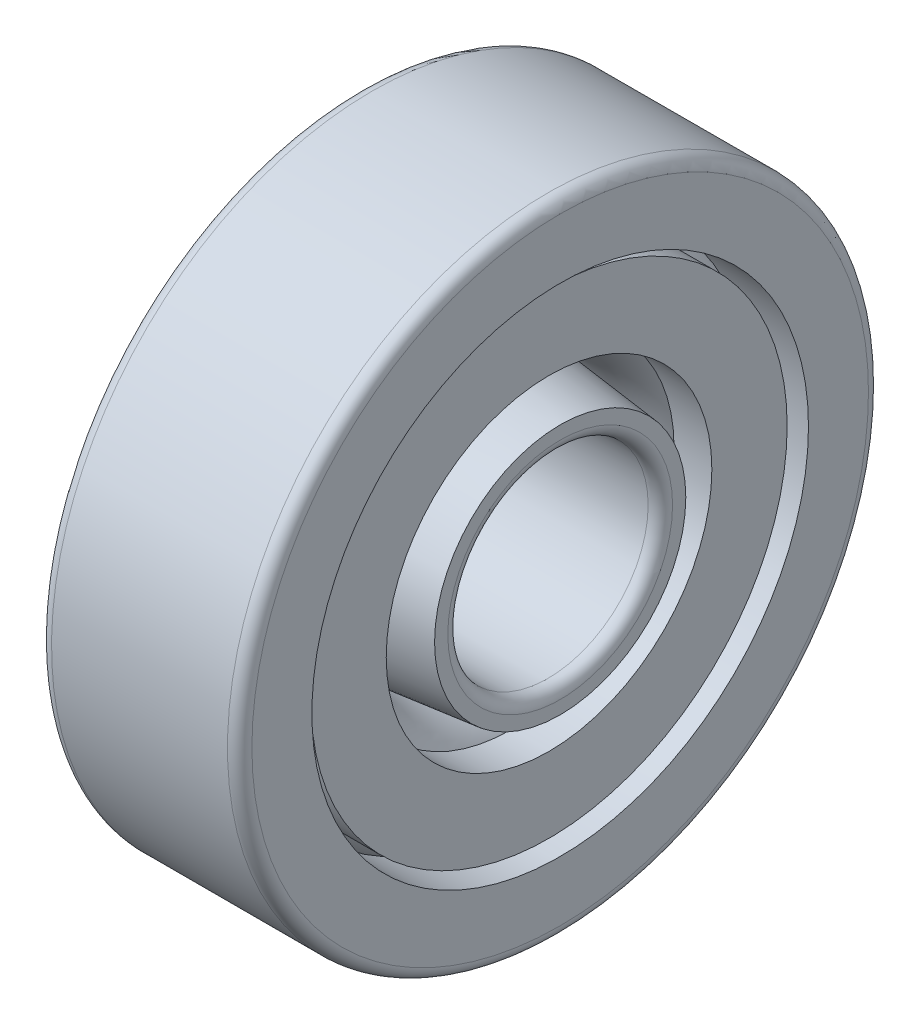
ISO-10303-21;
HEADER;
FILE_DESCRIPTION(('STEP AP214'),'2;1');
FILE_NAME('part.step','',(''),(''),'','','');
FILE_SCHEMA(('AUTOMOTIVE_DESIGN { 1 0 10303 214 1 1 1 1 }'));
ENDSEC;
DATA;
#1=APPLICATION_CONTEXT('core data for automotive mechanical design processes');
#2=APPLICATION_PROTOCOL_DEFINITION('international standard','automotive_design',2000,#1);
#3=PRODUCT_CONTEXT('',#1,'mechanical');
#4=PRODUCT('Part','Part','',(#3));
#5=PRODUCT_RELATED_PRODUCT_CATEGORY('part','',(#4));
#6=PRODUCT_DEFINITION_FORMATION('','',#4);
#7=PRODUCT_DEFINITION_CONTEXT('part definition',#1,'design');
#8=PRODUCT_DEFINITION('design','',#6,#7);
#9=PRODUCT_DEFINITION_SHAPE('','',#8);
#10=(LENGTH_UNIT() NAMED_UNIT(*) SI_UNIT(.MILLI.,.METRE.));
#11=(NAMED_UNIT(*) PLANE_ANGLE_UNIT() SI_UNIT($,.RADIAN.));
#12=(NAMED_UNIT(*) SI_UNIT($,.STERADIAN.) SOLID_ANGLE_UNIT());
#13=UNCERTAINTY_MEASURE_WITH_UNIT(LENGTH_MEASURE(1.E-05),#10,'distance_accuracy_value','');
#14=(GEOMETRIC_REPRESENTATION_CONTEXT(3) GLOBAL_UNCERTAINTY_ASSIGNED_CONTEXT((#13)) GLOBAL_UNIT_ASSIGNED_CONTEXT((#10,
#11,#12)) REPRESENTATION_CONTEXT('',''));
#15=CARTESIAN_POINT('',(0.,0.,0.));
#16=DIRECTION('',(0.,0.,1.));
#17=DIRECTION('',(1.,0.,0.));
#18=AXIS2_PLACEMENT_3D('',#15,#16,#17);
#19=CARTESIAN_POINT('',(-2.50063,3.155315,0.));
#20=DIRECTION('',(-1.,0.,0.));
#21=DIRECTION('',(0.,0.,1.));
#22=AXIS2_PLACEMENT_3D('',#19,#20,#21);
#23=PLANE('',#22);
#24=CARTESIAN_POINT('',(-2.50063,0.,0.));
#25=DIRECTION('',(-1.,0.,0.));
#26=DIRECTION('',(0.,0.,1.));
#27=AXIS2_PLACEMENT_3D('',#24,#25,#26);
#28=CIRCLE('',#27,2.80543);
#29=CARTESIAN_POINT('',(-2.50063,0.,2.80543));
#30=VERTEX_POINT('',#29);
#31=CARTESIAN_POINT('',(-2.50063,2.80543,0.));
#32=VERTEX_POINT('',#31);
#33=EDGE_CURVE('E73',#30,#32,#28,.T.);
#34=ORIENTED_EDGE('',*,*,#33,.F.);
#35=CARTESIAN_POINT('',(-2.50063,0.,0.));
#36=DIRECTION('',(-1.,0.,0.));
#37=DIRECTION('',(0.,0.,-1.));
#38=AXIS2_PLACEMENT_3D('',#35,#36,#37);
#39=CIRCLE('',#38,2.80543);
#40=CARTESIAN_POINT('',(-2.50063,0.,-2.80543));
#41=VERTEX_POINT('',#40);
#42=EDGE_CURVE('E76',#41,#30,#39,.T.);
#43=ORIENTED_EDGE('',*,*,#42,.F.);
#44=CARTESIAN_POINT('',(-2.50063,0.,0.));
#45=DIRECTION('',(-1.,0.,0.));
#46=DIRECTION('',(0.,1.,0.));
#47=AXIS2_PLACEMENT_3D('',#44,#45,#46);
#48=CIRCLE('',#47,2.80543);
#49=EDGE_CURVE('E69',#32,#41,#48,.T.);
#50=ORIENTED_EDGE('',*,*,#49,.F.);
#51=EDGE_LOOP('',(#34,#43,#50));
#52=FACE_BOUND('',#51,.T.);
#53=CARTESIAN_POINT('',(-2.50063,0.,0.));
#54=DIRECTION('',(1.,0.,0.));
#55=DIRECTION('',(0.,0.,-1.));
#56=AXIS2_PLACEMENT_3D('',#53,#54,#55);
#57=CIRCLE('',#56,3.81);
#58=CARTESIAN_POINT('',(-2.50063,0.,-3.81));
#59=VERTEX_POINT('',#58);
#60=EDGE_CURVE('E308',#59,#59,#57,.T.);
#61=ORIENTED_EDGE('',*,*,#60,.F.);
#62=EDGE_LOOP('',(#61));
#63=FACE_BOUND('',#62,.T.);
#64=ADVANCED_FACE('F16',(#52,#63),#23,.T.);
#65=CARTESIAN_POINT('',(-2.19583,0.,0.));
#66=DIRECTION('',(1.,0.,0.));
#67=DIRECTION('',(0.,0.,-1.));
#68=AXIS2_PLACEMENT_3D('',#65,#66,#67);
#69=TOROIDAL_SURFACE('',#68,2.80543,0.3048);
#70=ORIENTED_EDGE('',*,*,#49,.T.);
#71=ORIENTED_EDGE('',*,*,#42,.T.);
#72=ORIENTED_EDGE('',*,*,#33,.T.);
#73=EDGE_LOOP('',(#70,#71,#72));
#74=FACE_BOUND('',#73,.T.);
#75=CARTESIAN_POINT('',(-2.19583,0.,0.));
#76=DIRECTION('',(1.,0.,0.));
#77=DIRECTION('',(0.,1.,0.));
#78=AXIS2_PLACEMENT_3D('',#75,#76,#77);
#79=CIRCLE('',#78,2.50063);
#80=CARTESIAN_POINT('',(-2.19583,2.50063,0.));
#81=VERTEX_POINT('',#80);
#82=EDGE_CURVE('E311',#81,#81,#79,.T.);
#83=ORIENTED_EDGE('',*,*,#82,.T.);
#84=EDGE_LOOP('',(#83));
#85=FACE_BOUND('',#84,.T.);
#86=ADVANCED_FACE('F81',(#74,#85),#69,.T.);
#87=CARTESIAN_POINT('',(-2.50063,0.,0.));
#88=DIRECTION('',(1.,0.,0.));
#89=DIRECTION('',(0.,0.,-1.));
#90=AXIS2_PLACEMENT_3D('',#87,#88,#89);
#91=CYLINDRICAL_SURFACE('',#90,3.81);
#92=CARTESIAN_POINT('',(-1.04642143039982,0.,0.));
#93=DIRECTION('',(1.,0.,0.));
#94=DIRECTION('',(0.,0.,-1.));
#95=AXIS2_PLACEMENT_3D('',#92,#93,#94);
#96=CIRCLE('',#95,3.81);
#97=CARTESIAN_POINT('',(-1.04642143039982,0.,-3.81));
#98=VERTEX_POINT('',#97);
#99=EDGE_CURVE('E404',#98,#98,#96,.T.);
#100=ORIENTED_EDGE('',*,*,#99,.F.);
#101=EDGE_LOOP('',(#100));
#102=FACE_BOUND('',#101,.T.);
#103=ORIENTED_EDGE('',*,*,#60,.T.);
#104=EDGE_LOOP('',(#103));
#105=FACE_BOUND('',#104,.T.);
#106=ADVANCED_FACE('F102',(#102,#105),#91,.T.);
#107=CARTESIAN_POINT('',(-2.19583,0.,0.));
#108=DIRECTION('',(1.,0.,0.));
#109=DIRECTION('',(0.,0.,-1.));
#110=AXIS2_PLACEMENT_3D('',#107,#108,#109);
#111=CYLINDRICAL_SURFACE('',#110,2.50063);
#112=CARTESIAN_POINT('',(2.19583,0.,0.));
#113=DIRECTION('',(1.,0.,0.));
#114=DIRECTION('',(0.,0.,-1.));
#115=AXIS2_PLACEMENT_3D('',#112,#113,#114);
#116=CIRCLE('',#115,2.50063);
#117=CARTESIAN_POINT('',(2.19583,0.,-2.50063));
#118=VERTEX_POINT('',#117);
#119=EDGE_CURVE('E407',#118,#118,#116,.F.);
#120=ORIENTED_EDGE('',*,*,#119,.F.);
#121=EDGE_LOOP('',(#120));
#122=FACE_BOUND('',#121,.T.);
#123=ORIENTED_EDGE('',*,*,#82,.F.);
#124=EDGE_LOOP('',(#123));
#125=FACE_BOUND('',#124,.T.);
#126=ADVANCED_FACE('F121',(#122,#125),#111,.F.);
#127=CARTESIAN_POINT('',(0.,0.,0.));
#128=DIRECTION('',(1.,0.,0.));
#129=DIRECTION('',(0.,0.,-1.));
#130=AXIS2_PLACEMENT_3D('',#127,#128,#129);
#131=TOROIDAL_SURFACE('',#130,5.0038,1.5875);
#132=CARTESIAN_POINT('',(-1.279426516061,0.,0.));
#133=DIRECTION('',(1.,0.,0.));
#134=DIRECTION('',(0.,1.,0.));
#135=AXIS2_PLACEMENT_3D('',#132,#133,#134);
#136=CIRCLE('',#135,4.064);
#137=CARTESIAN_POINT('',(-1.279426516061,4.064,0.));
#138=VERTEX_POINT('',#137);
#139=EDGE_CURVE('E154',#138,#138,#136,.F.);
#140=ORIENTED_EDGE('',*,*,#139,.T.);
#141=EDGE_LOOP('',(#140));
#142=FACE_BOUND('',#141,.T.);
#143=ORIENTED_EDGE('',*,*,#99,.T.);
#144=EDGE_LOOP('',(#143));
#145=FACE_BOUND('',#144,.T.);
#146=ADVANCED_FACE('F118',(#142,#145),#131,.T.);
#147=CARTESIAN_POINT('',(2.19583,0.,0.));
#148=DIRECTION('',(1.,0.,0.));
#149=DIRECTION('',(0.,0.,-1.));
#150=AXIS2_PLACEMENT_3D('',#147,#148,#149);
#151=TOROIDAL_SURFACE('',#150,2.80543,0.3048);
#152=ORIENTED_EDGE('',*,*,#119,.T.);
#153=EDGE_LOOP('',(#152));
#154=FACE_BOUND('',#153,.T.);
#155=CARTESIAN_POINT('',(2.50063,0.,0.));
#156=DIRECTION('',(1.,0.,0.));
#157=DIRECTION('',(0.,0.,1.));
#158=AXIS2_PLACEMENT_3D('',#155,#156,#157);
#159=CIRCLE('',#158,2.80543);
#160=CARTESIAN_POINT('',(2.50063,0.,-2.80543));
#161=VERTEX_POINT('',#160);
#162=CARTESIAN_POINT('',(2.50063,0.,2.80543));
#163=VERTEX_POINT('',#162);
#164=EDGE_CURVE('E150',#161,#163,#159,.F.);
#165=ORIENTED_EDGE('',*,*,#164,.F.);
#166=CARTESIAN_POINT('',(2.50063,0.,0.));
#167=DIRECTION('',(1.,0.,0.));
#168=DIRECTION('',(0.,0.,-1.));
#169=AXIS2_PLACEMENT_3D('',#166,#167,#168);
#170=CIRCLE('',#169,2.80543);
#171=CARTESIAN_POINT('',(2.50063,2.80543,0.));
#172=VERTEX_POINT('',#171);
#173=EDGE_CURVE('E152',#172,#161,#170,.F.);
#174=ORIENTED_EDGE('',*,*,#173,.F.);
#175=CARTESIAN_POINT('',(2.50063,0.,0.));
#176=DIRECTION('',(1.,0.,0.));
#177=DIRECTION('',(0.,1.,0.));
#178=AXIS2_PLACEMENT_3D('',#175,#176,#177);
#179=CIRCLE('',#178,2.80543);
#180=EDGE_CURVE('E148',#163,#172,#179,.F.);
#181=ORIENTED_EDGE('',*,*,#180,.F.);
#182=EDGE_LOOP('',(#165,#174,#181));
#183=FACE_BOUND('',#182,.T.);
#184=ADVANCED_FACE('F120',(#154,#183),#151,.T.);
#185=CARTESIAN_POINT('',(-2.2225,0.,0.));
#186=DIRECTION('',(1.,0.,0.));
#187=DIRECTION('',(0.,0.,-1.));
#188=AXIS2_PLACEMENT_3D('',#185,#186,#187);
#189=CYLINDRICAL_SURFACE('',#188,4.064);
#190=CARTESIAN_POINT('',(-2.2225,0.,0.));
#191=DIRECTION('',(1.,0.,0.));
#192=DIRECTION('',(0.,0.,-1.));
#193=AXIS2_PLACEMENT_3D('',#190,#191,#192);
#194=CIRCLE('',#193,4.064);
#195=CARTESIAN_POINT('',(-2.2225,0.,-4.064));
#196=VERTEX_POINT('',#195);
#197=EDGE_CURVE('E159',#196,#196,#194,.T.);
#198=ORIENTED_EDGE('',*,*,#197,.F.);
#199=EDGE_LOOP('',(#198));
#200=FACE_BOUND('',#199,.T.);
#201=ORIENTED_EDGE('',*,*,#139,.F.);
#202=EDGE_LOOP('',(#201));
#203=FACE_BOUND('',#202,.T.);
#204=ADVANCED_FACE('F126',(#200,#203),#189,.F.);
#205=CARTESIAN_POINT('',(2.50063,2.81813,0.));
#206=DIRECTION('',(1.,0.,0.));
#207=DIRECTION('',(0.,0.,-1.));
#208=AXIS2_PLACEMENT_3D('',#205,#206,#207);
#209=PLANE('',#208);
#210=ORIENTED_EDGE('',*,*,#173,.T.);
#211=ORIENTED_EDGE('',*,*,#164,.T.);
#212=ORIENTED_EDGE('',*,*,#180,.T.);
#213=EDGE_LOOP('',(#210,#211,#212));
#214=FACE_BOUND('',#213,.T.);
#215=CARTESIAN_POINT('',(2.50063000004275,0.,0.));
#216=DIRECTION('',(-1.,0.,0.));
#217=DIRECTION('',(0.,0.,1.));
#218=AXIS2_PLACEMENT_3D('',#215,#216,#217);
#219=CIRCLE('',#218,3.13563000016333);
#220=CARTESIAN_POINT('',(2.50063000004275,0.,3.13563000016333));
#221=VERTEX_POINT('',#220);
#222=EDGE_CURVE('E297',#221,#221,#219,.T.);
#223=ORIENTED_EDGE('',*,*,#222,.F.);
#224=EDGE_LOOP('',(#223));
#225=FACE_BOUND('',#224,.T.);
#226=ADVANCED_FACE('F156',(#214,#225),#209,.T.);
#227=CARTESIAN_POINT('',(-2.2225,5.0038,0.));
#228=DIRECTION('',(-1.,0.,0.));
#229=DIRECTION('',(0.,0.,1.));
#230=AXIS2_PLACEMENT_3D('',#227,#228,#229);
#231=PLANE('',#230);
#232=ORIENTED_EDGE('',*,*,#197,.T.);
#233=EDGE_LOOP('',(#232));
#234=FACE_BOUND('',#233,.T.);
#235=CARTESIAN_POINT('',(-2.2225,0.,0.));
#236=DIRECTION('',(1.,0.,0.));
#237=DIRECTION('',(0.,0.,-1.));
#238=AXIS2_PLACEMENT_3D('',#235,#236,#237);
#239=CIRCLE('',#238,5.9436);
#240=CARTESIAN_POINT('',(-2.2225,0.,-5.9436));
#241=VERTEX_POINT('',#240);
#242=EDGE_CURVE('E294',#241,#241,#239,.T.);
#243=ORIENTED_EDGE('',*,*,#242,.F.);
#244=EDGE_LOOP('',(#243));
#245=FACE_BOUND('',#244,.T.);
#246=ADVANCED_FACE('F177',(#234,#245),#231,.T.);
#247=CARTESIAN_POINT('',(-0.171259060152806,0.,0.));
#248=DIRECTION('',(-1.,0.,0.));
#249=DIRECTION('',(0.,0.,1.));
#250=AXIS2_PLACEMENT_3D('',#247,#248,#249);
#251=CONICAL_SURFACE('',#250,3.42556472450184,0.108090077831734);
#252=ORIENTED_EDGE('',*,*,#222,.T.);
#253=EDGE_LOOP('',(#252));
#254=FACE_BOUND('',#253,.T.);
#255=CARTESIAN_POINT('',(-0.17125906042468,0.,0.));
#256=DIRECTION('',(1.,0.,0.));
#257=DIRECTION('',(0.,0.,-1.));
#258=AXIS2_PLACEMENT_3D('',#255,#256,#257);
#259=CIRCLE('',#258,3.42556472469329);
#260=CARTESIAN_POINT('',(-0.17125906042468,0.,-3.42556472469329));
#261=VERTEX_POINT('',#260);
#262=EDGE_CURVE('E292',#261,#261,#259,.F.);
#263=ORIENTED_EDGE('',*,*,#262,.F.);
#264=EDGE_LOOP('',(#263));
#265=FACE_BOUND('',#264,.T.);
#266=ADVANCED_FACE('F190',(#254,#265),#251,.T.);
#267=CARTESIAN_POINT('',(-2.2225,0.,0.));
#268=DIRECTION('',(1.,0.,0.));
#269=DIRECTION('',(0.,0.,-1.));
#270=AXIS2_PLACEMENT_3D('',#267,#268,#269);
#271=CYLINDRICAL_SURFACE('',#270,5.9436);
#272=CARTESIAN_POINT('',(-1.279426516061,0.,0.));
#273=DIRECTION('',(1.,0.,0.));
#274=DIRECTION('',(0.,0.,-1.));
#275=AXIS2_PLACEMENT_3D('',#272,#273,#274);
#276=CIRCLE('',#275,5.9436);
#277=CARTESIAN_POINT('',(-1.279426516061,0.,-5.9436));
#278=VERTEX_POINT('',#277);
#279=EDGE_CURVE('E289',#278,#278,#276,.T.);
#280=ORIENTED_EDGE('',*,*,#279,.F.);
#281=EDGE_LOOP('',(#280));
#282=FACE_BOUND('',#281,.T.);
#283=ORIENTED_EDGE('',*,*,#242,.T.);
#284=EDGE_LOOP('',(#283));
#285=FACE_BOUND('',#284,.T.);
#286=ADVANCED_FACE('F194',(#282,#285),#271,.T.);
#287=CARTESIAN_POINT('',(0.,0.,0.));
#288=DIRECTION('',(1.,0.,0.));
#289=DIRECTION('',(0.,0.,-1.));
#290=AXIS2_PLACEMENT_3D('',#287,#288,#289);
#291=TOROIDAL_SURFACE('',#290,5.0038,1.5875);
#292=CARTESIAN_POINT('',(-1.04642143039982,0.,0.));
#293=DIRECTION('',(1.,0.,0.));
#294=DIRECTION('',(0.,1.,0.));
#295=AXIS2_PLACEMENT_3D('',#292,#293,#294);
#296=CIRCLE('',#295,6.1976);
#297=CARTESIAN_POINT('',(-1.04642143039982,6.1976,0.));
#298=VERTEX_POINT('',#297);
#299=EDGE_CURVE('E286',#298,#298,#296,.F.);
#300=ORIENTED_EDGE('',*,*,#299,.T.);
#301=EDGE_LOOP('',(#300));
#302=FACE_BOUND('',#301,.T.);
#303=ORIENTED_EDGE('',*,*,#279,.T.);
#304=EDGE_LOOP('',(#303));
#305=FACE_BOUND('',#304,.T.);
#306=ADVANCED_FACE('F198',(#302,#305),#291,.T.);
#307=CARTESIAN_POINT('',(0.,0.,0.));
#308=DIRECTION('',(1.,0.,0.));
#309=DIRECTION('',(0.,0.,-1.));
#310=AXIS2_PLACEMENT_3D('',#307,#308,#309);
#311=TOROIDAL_SURFACE('',#310,5.0038,1.5875);
#312=ORIENTED_EDGE('',*,*,#262,.T.);
#313=EDGE_LOOP('',(#312));
#314=FACE_BOUND('',#313,.T.);
#315=CARTESIAN_POINT('',(1.279426516061,0.,0.));
#316=DIRECTION('',(1.,0.,0.));
#317=DIRECTION('',(0.,1.,0.));
#318=AXIS2_PLACEMENT_3D('',#315,#316,#317);
#319=CIRCLE('',#318,4.064);
#320=CARTESIAN_POINT('',(1.279426516061,4.064,0.));
#321=VERTEX_POINT('',#320);
#322=EDGE_CURVE('E277',#321,#321,#319,.T.);
#323=ORIENTED_EDGE('',*,*,#322,.T.);
#324=EDGE_LOOP('',(#323));
#325=FACE_BOUND('',#324,.T.);
#326=ADVANCED_FACE('F202',(#314,#325),#311,.T.);
#327=CARTESIAN_POINT('',(-2.50063,0.,0.));
#328=DIRECTION('',(1.,0.,0.));
#329=DIRECTION('',(0.,0.,-1.));
#330=AXIS2_PLACEMENT_3D('',#327,#328,#329);
#331=CYLINDRICAL_SURFACE('',#330,6.1976);
#332=CARTESIAN_POINT('',(-2.50063,0.,0.));
#333=DIRECTION('',(1.,0.,0.));
#334=DIRECTION('',(0.,0.,-1.));
#335=AXIS2_PLACEMENT_3D('',#332,#333,#334);
#336=CIRCLE('',#335,6.1976);
#337=CARTESIAN_POINT('',(-2.50063,0.,-6.1976));
#338=VERTEX_POINT('',#337);
#339=EDGE_CURVE('E285',#338,#338,#336,.T.);
#340=ORIENTED_EDGE('',*,*,#339,.F.);
#341=EDGE_LOOP('',(#340));
#342=FACE_BOUND('',#341,.T.);
#343=ORIENTED_EDGE('',*,*,#299,.F.);
#344=EDGE_LOOP('',(#343));
#345=FACE_BOUND('',#344,.T.);
#346=ADVANCED_FACE('F206',(#342,#345),#331,.F.);
#347=CARTESIAN_POINT('',(1.279426516061,0.,0.));
#348=DIRECTION('',(1.,0.,0.));
#349=DIRECTION('',(0.,0.,-1.));
#350=AXIS2_PLACEMENT_3D('',#347,#348,#349);
#351=CYLINDRICAL_SURFACE('',#350,4.064);
#352=ORIENTED_EDGE('',*,*,#322,.F.);
#353=EDGE_LOOP('',(#352));
#354=FACE_BOUND('',#353,.T.);
#355=CARTESIAN_POINT('',(2.2225,0.,0.));
#356=DIRECTION('',(1.,0.,0.));
#357=DIRECTION('',(0.,0.,-1.));
#358=AXIS2_PLACEMENT_3D('',#355,#356,#357);
#359=CIRCLE('',#358,4.064);
#360=CARTESIAN_POINT('',(2.2225,0.,-4.064));
#361=VERTEX_POINT('',#360);
#362=EDGE_CURVE('E389',#361,#361,#359,.F.);
#363=ORIENTED_EDGE('',*,*,#362,.F.);
#364=EDGE_LOOP('',(#363));
#365=FACE_BOUND('',#364,.T.);
#366=ADVANCED_FACE('F232',(#354,#365),#351,.F.);
#367=CARTESIAN_POINT('',(-2.50063,7.098665,0.));
#368=DIRECTION('',(-1.,0.,0.));
#369=DIRECTION('',(0.,0.,1.));
#370=AXIS2_PLACEMENT_3D('',#367,#368,#369);
#371=PLANE('',#370);
#372=ORIENTED_EDGE('',*,*,#339,.T.);
#373=EDGE_LOOP('',(#372));
#374=FACE_BOUND('',#373,.T.);
#375=CARTESIAN_POINT('',(-2.50063,0.,0.));
#376=DIRECTION('',(1.,0.,0.));
#377=DIRECTION('',(0.,0.,-1.));
#378=AXIS2_PLACEMENT_3D('',#375,#376,#377);
#379=CIRCLE('',#378,7.69493);
#380=CARTESIAN_POINT('',(-2.50063,0.,-7.69493));
#381=VERTEX_POINT('',#380);
#382=CARTESIAN_POINT('',(-2.50063,7.69493,0.));
#383=VERTEX_POINT('',#382);
#384=EDGE_CURVE('E386',#381,#383,#379,.T.);
#385=ORIENTED_EDGE('',*,*,#384,.F.);
#386=CARTESIAN_POINT('',(-2.50063,0.,0.));
#387=DIRECTION('',(1.,0.,0.));
#388=DIRECTION('',(0.,0.,1.));
#389=AXIS2_PLACEMENT_3D('',#386,#387,#388);
#390=CIRCLE('',#389,7.69493);
#391=CARTESIAN_POINT('',(-2.50063,0.,7.69493));
#392=VERTEX_POINT('',#391);
#393=EDGE_CURVE('E246',#392,#381,#390,.T.);
#394=ORIENTED_EDGE('',*,*,#393,.F.);
#395=CARTESIAN_POINT('',(-2.50063,0.,0.));
#396=DIRECTION('',(1.,0.,0.));
#397=DIRECTION('',(0.,1.,0.));
#398=AXIS2_PLACEMENT_3D('',#395,#396,#397);
#399=CIRCLE('',#398,7.69493);
#400=EDGE_CURVE('E215',#383,#392,#399,.T.);
#401=ORIENTED_EDGE('',*,*,#400,.F.);
#402=EDGE_LOOP('',(#385,#394,#401));
#403=FACE_BOUND('',#402,.T.);
#404=ADVANCED_FACE('F222',(#374,#403),#371,.T.);
#405=CARTESIAN_POINT('',(2.2225,5.0038,0.));
#406=DIRECTION('',(1.,0.,0.));
#407=DIRECTION('',(0.,0.,-1.));
#408=AXIS2_PLACEMENT_3D('',#405,#406,#407);
#409=PLANE('',#408);
#410=ORIENTED_EDGE('',*,*,#362,.T.);
#411=EDGE_LOOP('',(#410));
#412=FACE_BOUND('',#411,.T.);
#413=CARTESIAN_POINT('',(2.2225,0.,0.));
#414=DIRECTION('',(1.,0.,0.));
#415=DIRECTION('',(0.,0.,-1.));
#416=AXIS2_PLACEMENT_3D('',#413,#414,#415);
#417=CIRCLE('',#416,5.9436);
#418=CARTESIAN_POINT('',(2.2225,0.,-5.9436));
#419=VERTEX_POINT('',#418);
#420=EDGE_CURVE('E383',#419,#419,#417,.F.);
#421=ORIENTED_EDGE('',*,*,#420,.F.);
#422=EDGE_LOOP('',(#421));
#423=FACE_BOUND('',#422,.T.);
#424=ADVANCED_FACE('F231',(#412,#423),#409,.T.);
#425=CARTESIAN_POINT('',(-2.19583,0.,0.));
#426=DIRECTION('',(1.,0.,0.));
#427=DIRECTION('',(0.,0.,-1.));
#428=AXIS2_PLACEMENT_3D('',#425,#426,#427);
#429=TOROIDAL_SURFACE('',#428,7.69493,0.3048);
#430=ORIENTED_EDGE('',*,*,#393,.T.);
#431=ORIENTED_EDGE('',*,*,#384,.T.);
#432=ORIENTED_EDGE('',*,*,#400,.T.);
#433=EDGE_LOOP('',(#430,#431,#432));
#434=FACE_BOUND('',#433,.T.);
#435=CARTESIAN_POINT('',(-2.19583,0.,0.));
#436=DIRECTION('',(1.,0.,0.));
#437=DIRECTION('',(0.,1.,0.));
#438=AXIS2_PLACEMENT_3D('',#435,#436,#437);
#439=CIRCLE('',#438,7.99973);
#440=CARTESIAN_POINT('',(-2.19583,7.99973,0.));
#441=VERTEX_POINT('',#440);
#442=EDGE_CURVE('E381',#441,#441,#439,.T.);
#443=ORIENTED_EDGE('',*,*,#442,.F.);
#444=EDGE_LOOP('',(#443));
#445=FACE_BOUND('',#444,.T.);
#446=ADVANCED_FACE('F259',(#434,#445),#429,.T.);
#447=CARTESIAN_POINT('',(1.279426516061,0.,0.));
#448=DIRECTION('',(1.,0.,0.));
#449=DIRECTION('',(0.,0.,-1.));
#450=AXIS2_PLACEMENT_3D('',#447,#448,#449);
#451=CYLINDRICAL_SURFACE('',#450,5.9436);
#452=ORIENTED_EDGE('',*,*,#420,.T.);
#453=EDGE_LOOP('',(#452));
#454=FACE_BOUND('',#453,.T.);
#455=CARTESIAN_POINT('',(1.279426516061,0.,0.));
#456=DIRECTION('',(1.,0.,0.));
#457=DIRECTION('',(0.,0.,-1.));
#458=AXIS2_PLACEMENT_3D('',#455,#456,#457);
#459=CIRCLE('',#458,5.9436);
#460=CARTESIAN_POINT('',(1.279426516061,0.,-5.9436));
#461=VERTEX_POINT('',#460);
#462=EDGE_CURVE('E378',#461,#461,#459,.F.);
#463=ORIENTED_EDGE('',*,*,#462,.F.);
#464=EDGE_LOOP('',(#463));
#465=FACE_BOUND('',#464,.T.);
#466=ADVANCED_FACE('F263',(#454,#465),#451,.T.);
#467=CARTESIAN_POINT('',(-2.19583,0.,0.));
#468=DIRECTION('',(1.,0.,0.));
#469=DIRECTION('',(0.,0.,-1.));
#470=AXIS2_PLACEMENT_3D('',#467,#468,#469);
#471=CYLINDRICAL_SURFACE('',#470,7.99973);
#472=CARTESIAN_POINT('',(2.19583,0.,0.));
#473=DIRECTION('',(1.,0.,0.));
#474=DIRECTION('',(0.,0.,-1.));
#475=AXIS2_PLACEMENT_3D('',#472,#473,#474);
#476=CIRCLE('',#475,7.99973);
#477=CARTESIAN_POINT('',(2.19583,0.,-7.99973));
#478=VERTEX_POINT('',#477);
#479=EDGE_CURVE('E375',#478,#478,#476,.T.);
#480=ORIENTED_EDGE('',*,*,#479,.F.);
#481=EDGE_LOOP('',(#480));
#482=FACE_BOUND('',#481,.T.);
#483=ORIENTED_EDGE('',*,*,#442,.T.);
#484=EDGE_LOOP('',(#483));
#485=FACE_BOUND('',#484,.T.);
#486=ADVANCED_FACE('F433',(#482,#485),#471,.T.);
#487=CARTESIAN_POINT('',(0.,0.,0.));
#488=DIRECTION('',(1.,0.,0.));
#489=DIRECTION('',(0.,0.,-1.));
#490=AXIS2_PLACEMENT_3D('',#487,#488,#489);
#491=TOROIDAL_SURFACE('',#490,5.0038,1.5875);
#492=CARTESIAN_POINT('',(1.04642143039982,0.,0.));
#493=DIRECTION('',(1.,0.,0.));
#494=DIRECTION('',(0.,1.,0.));
#495=AXIS2_PLACEMENT_3D('',#492,#493,#494);
#496=CIRCLE('',#495,6.1976);
#497=CARTESIAN_POINT('',(1.04642143039982,6.1976,0.));
#498=VERTEX_POINT('',#497);
#499=EDGE_CURVE('E367',#498,#498,#496,.T.);
#500=ORIENTED_EDGE('',*,*,#499,.T.);
#501=EDGE_LOOP('',(#500));
#502=FACE_BOUND('',#501,.T.);
#503=ORIENTED_EDGE('',*,*,#462,.T.);
#504=EDGE_LOOP('',(#503));
#505=FACE_BOUND('',#504,.T.);
#506=ADVANCED_FACE('F330',(#502,#505),#491,.T.);
#507=CARTESIAN_POINT('',(2.19583,0.,0.));
#508=DIRECTION('',(1.,0.,0.));
#509=DIRECTION('',(0.,0.,-1.));
#510=AXIS2_PLACEMENT_3D('',#507,#508,#509);
#511=TOROIDAL_SURFACE('',#510,7.69493,0.3048);
#512=CARTESIAN_POINT('',(2.50063,0.,0.));
#513=DIRECTION('',(-1.,0.,0.));
#514=DIRECTION('',(0.,1.,0.));
#515=AXIS2_PLACEMENT_3D('',#512,#513,#514);
#516=CIRCLE('',#515,7.69493);
#517=CARTESIAN_POINT('',(2.50063,0.,-7.69493));
#518=VERTEX_POINT('',#517);
#519=CARTESIAN_POINT('',(2.50063,7.69493,0.));
#520=VERTEX_POINT('',#519);
#521=EDGE_CURVE('E338',#518,#520,#516,.F.);
#522=ORIENTED_EDGE('',*,*,#521,.F.);
#523=CARTESIAN_POINT('',(2.50063,0.,0.));
#524=DIRECTION('',(-1.,0.,0.));
#525=DIRECTION('',(0.,0.,-1.));
#526=AXIS2_PLACEMENT_3D('',#523,#524,#525);
#527=CIRCLE('',#526,7.69493);
#528=CARTESIAN_POINT('',(2.50063,0.,7.69493));
#529=VERTEX_POINT('',#528);
#530=EDGE_CURVE('E29',#529,#518,#527,.F.);
#531=ORIENTED_EDGE('',*,*,#530,.F.);
#532=CARTESIAN_POINT('',(2.50063,0.,0.));
#533=DIRECTION('',(-1.,0.,0.));
#534=DIRECTION('',(0.,0.,1.));
#535=AXIS2_PLACEMENT_3D('',#532,#533,#534);
#536=CIRCLE('',#535,7.69493);
#537=EDGE_CURVE('E313',#520,#529,#536,.F.);
#538=ORIENTED_EDGE('',*,*,#537,.F.);
#539=EDGE_LOOP('',(#522,#531,#538));
#540=FACE_BOUND('',#539,.T.);
#541=ORIENTED_EDGE('',*,*,#479,.T.);
#542=EDGE_LOOP('',(#541));
#543=FACE_BOUND('',#542,.T.);
#544=ADVANCED_FACE('F320',(#540,#543),#511,.T.);
#545=CARTESIAN_POINT('',(1.04642143039982,0.,0.));
#546=DIRECTION('',(1.,0.,0.));
#547=DIRECTION('',(0.,0.,-1.));
#548=AXIS2_PLACEMENT_3D('',#545,#546,#547);
#549=CYLINDRICAL_SURFACE('',#548,6.1976);
#550=ORIENTED_EDGE('',*,*,#499,.F.);
#551=EDGE_LOOP('',(#550));
#552=FACE_BOUND('',#551,.T.);
#553=CARTESIAN_POINT('',(2.50063,0.,0.));
#554=DIRECTION('',(1.,0.,0.));
#555=DIRECTION('',(0.,0.,-1.));
#556=AXIS2_PLACEMENT_3D('',#553,#554,#555);
#557=CIRCLE('',#556,6.1976);
#558=CARTESIAN_POINT('',(2.50063,0.,-6.1976));
#559=VERTEX_POINT('',#558);
#560=EDGE_CURVE('E11',#559,#559,#557,.F.);
#561=ORIENTED_EDGE('',*,*,#560,.F.);
#562=EDGE_LOOP('',(#561));
#563=FACE_BOUND('',#562,.T.);
#564=ADVANCED_FACE('F329',(#552,#563),#549,.F.);
#565=CARTESIAN_POINT('',(2.50063,7.098665,0.));
#566=DIRECTION('',(1.,0.,0.));
#567=DIRECTION('',(0.,0.,-1.));
#568=AXIS2_PLACEMENT_3D('',#565,#566,#567);
#569=PLANE('',#568);
#570=ORIENTED_EDGE('',*,*,#560,.T.);
#571=EDGE_LOOP('',(#570));
#572=FACE_BOUND('',#571,.T.);
#573=ORIENTED_EDGE('',*,*,#537,.T.);
#574=ORIENTED_EDGE('',*,*,#530,.T.);
#575=ORIENTED_EDGE('',*,*,#521,.T.);
#576=EDGE_LOOP('',(#573,#574,#575));
#577=FACE_BOUND('',#576,.T.);
#578=ADVANCED_FACE('F18',(#572,#577),#569,.T.);
#579=CLOSED_SHELL('',(#64,#86,#106,#126,#146,#184,#204,#226,#246,#266,#286,#306,#326,#346,#366,
#404,#424,#446,#466,#486,#506,#544,#564,#578));
#580=MANIFOLD_SOLID_BREP('B1',#579);
#581=ADVANCED_BREP_SHAPE_REPRESENTATION('',(#18,#580),#14);
#582=SHAPE_DEFINITION_REPRESENTATION(#9,#581);
ENDSEC;
END-ISO-10303-21;
